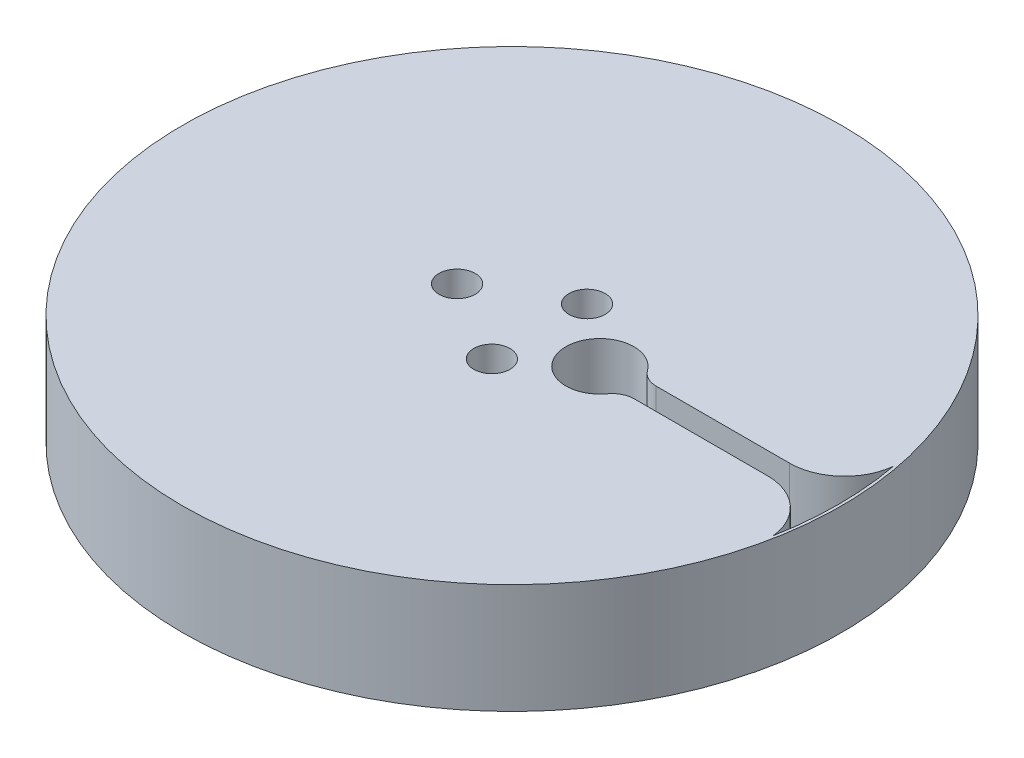
ISO-10303-21;
HEADER;
FILE_DESCRIPTION(('STEP AP214'),'2;1');
FILE_NAME('part.step','',(''),(''),'','','');
FILE_SCHEMA(('AUTOMOTIVE_DESIGN { 1 0 10303 214 1 1 1 1 }'));
ENDSEC;
DATA;
#1=APPLICATION_CONTEXT('core data for automotive mechanical design processes');
#2=APPLICATION_PROTOCOL_DEFINITION('international standard','automotive_design',2000,#1);
#3=PRODUCT_CONTEXT('',#1,'mechanical');
#4=PRODUCT('Part','Part','',(#3));
#5=PRODUCT_RELATED_PRODUCT_CATEGORY('part','',(#4));
#6=PRODUCT_DEFINITION_FORMATION('','',#4);
#7=PRODUCT_DEFINITION_CONTEXT('part definition',#1,'design');
#8=PRODUCT_DEFINITION('design','',#6,#7);
#9=PRODUCT_DEFINITION_SHAPE('','',#8);
#10=(LENGTH_UNIT() NAMED_UNIT(*) SI_UNIT(.MILLI.,.METRE.));
#11=(NAMED_UNIT(*) PLANE_ANGLE_UNIT() SI_UNIT($,.RADIAN.));
#12=(NAMED_UNIT(*) SI_UNIT($,.STERADIAN.) SOLID_ANGLE_UNIT());
#13=UNCERTAINTY_MEASURE_WITH_UNIT(LENGTH_MEASURE(1.E-05),#10,'distance_accuracy_value','');
#14=(GEOMETRIC_REPRESENTATION_CONTEXT(3) GLOBAL_UNCERTAINTY_ASSIGNED_CONTEXT((#13)) GLOBAL_UNIT_ASSIGNED_CONTEXT((#10,
#11,#12)) REPRESENTATION_CONTEXT('',''));
#15=CARTESIAN_POINT('',(0.,0.,0.));
#16=DIRECTION('',(0.,0.,1.));
#17=DIRECTION('',(1.,0.,0.));
#18=AXIS2_PLACEMENT_3D('',#15,#16,#17);
#19=CARTESIAN_POINT('',(24.2693221990232,10.,-6.));
#20=DIRECTION('',(0.,-1.,0.));
#21=DIRECTION('',(0.,0.,-1.));
#22=AXIS2_PLACEMENT_3D('',#19,#20,#21);
#23=CYLINDRICAL_SURFACE('',#22,5.);
#24=CARTESIAN_POINT('',(24.2693221990232,0.,-6.));
#25=DIRECTION('',(0.,1.,0.));
#26=DIRECTION('',(0.,0.,1.));
#27=AXIS2_PLACEMENT_3D('',#24,#25,#26);
#28=CIRCLE('',#27,5.);
#29=CARTESIAN_POINT('',(29.2417500663392,0.,-5.47563266278417));
#30=VERTEX_POINT('',#29);
#31=CARTESIAN_POINT('',(24.2693221990232,0.,-1.));
#32=VERTEX_POINT('',#31);
#33=EDGE_CURVE('E128',#30,#32,#28,.F.);
#34=ORIENTED_EDGE('',*,*,#33,.F.);
#35=DIRECTION('',(0.,-1.,0.));
#36=VECTOR('',#35,1.);
#37=CARTESIAN_POINT('',(29.2417500663392,5.,-5.47563266278417));
#38=LINE('',#37,#36);
#39=CARTESIAN_POINT('',(29.2417500663392,10.,-5.47563266278417));
#40=VERTEX_POINT('',#39);
#41=EDGE_CURVE('E119',#30,#40,#38,.F.);
#42=ORIENTED_EDGE('',*,*,#41,.T.);
#43=CARTESIAN_POINT('',(24.2693221990232,10.,-6.));
#44=DIRECTION('',(0.,1.,0.));
#45=DIRECTION('',(0.,0.,1.));
#46=AXIS2_PLACEMENT_3D('',#43,#44,#45);
#47=CIRCLE('',#46,5.);
#48=CARTESIAN_POINT('',(24.2693221990232,10.,-1.));
#49=VERTEX_POINT('',#48);
#50=EDGE_CURVE('E117',#49,#40,#47,.T.);
#51=ORIENTED_EDGE('',*,*,#50,.F.);
#52=DIRECTION('',(0.,-1.,0.));
#53=VECTOR('',#52,1.);
#54=CARTESIAN_POINT('',(24.2693221990232,10.,-1.));
#55=LINE('',#54,#53);
#56=EDGE_CURVE('E123',#32,#49,#55,.F.);
#57=ORIENTED_EDGE('',*,*,#56,.F.);
#58=EDGE_LOOP('',(#34,#42,#51,#57));
#59=FACE_BOUND('',#58,.T.);
#60=ADVANCED_FACE('F43',(#59),#23,.T.);
#61=CARTESIAN_POINT('',(24.2693221990232,10.,6.));
#62=DIRECTION('',(0.,-1.,0.));
#63=DIRECTION('',(0.,0.,-1.));
#64=AXIS2_PLACEMENT_3D('',#61,#62,#63);
#65=CYLINDRICAL_SURFACE('',#64,5.);
#66=CARTESIAN_POINT('',(24.2693221990232,10.,6.));
#67=DIRECTION('',(0.,1.,0.));
#68=DIRECTION('',(0.,0.,1.));
#69=AXIS2_PLACEMENT_3D('',#66,#67,#68);
#70=CIRCLE('',#69,5.);
#71=CARTESIAN_POINT('',(29.2417500663392,10.,5.47563266278417));
#72=VERTEX_POINT('',#71);
#73=CARTESIAN_POINT('',(24.2693221990232,10.,1.));
#74=VERTEX_POINT('',#73);
#75=EDGE_CURVE('E113',#72,#74,#70,.T.);
#76=ORIENTED_EDGE('',*,*,#75,.F.);
#77=DIRECTION('',(0.,-1.,0.));
#78=VECTOR('',#77,1.);
#79=CARTESIAN_POINT('',(29.2417500663392,5.,5.47563266278417));
#80=LINE('',#79,#78);
#81=CARTESIAN_POINT('',(29.2417500663392,0.,5.47563266278417));
#82=VERTEX_POINT('',#81);
#83=EDGE_CURVE('E11',#72,#82,#80,.T.);
#84=ORIENTED_EDGE('',*,*,#83,.T.);
#85=CARTESIAN_POINT('',(24.2693221990232,0.,6.));
#86=DIRECTION('',(0.,1.,0.));
#87=DIRECTION('',(0.,0.,1.));
#88=AXIS2_PLACEMENT_3D('',#85,#86,#87);
#89=CIRCLE('',#88,5.);
#90=CARTESIAN_POINT('',(24.2693221990232,0.,1.));
#91=VERTEX_POINT('',#90);
#92=EDGE_CURVE('E143',#91,#82,#89,.F.);
#93=ORIENTED_EDGE('',*,*,#92,.F.);
#94=DIRECTION('',(0.,-1.,0.));
#95=VECTOR('',#94,1.);
#96=CARTESIAN_POINT('',(24.2693221990232,10.,1.));
#97=LINE('',#96,#95);
#98=EDGE_CURVE('E52',#74,#91,#97,.T.);
#99=ORIENTED_EDGE('',*,*,#98,.F.);
#100=EDGE_LOOP('',(#76,#84,#93,#99));
#101=FACE_BOUND('',#100,.T.);
#102=ADVANCED_FACE('F45',(#101),#65,.T.);
#103=CARTESIAN_POINT('',(0.,10.,0.));
#104=DIRECTION('',(0.,-1.,0.));
#105=DIRECTION('',(0.,0.,-1.));
#106=AXIS2_PLACEMENT_3D('',#103,#104,#105);
#107=CYLINDRICAL_SURFACE('',#106,30.);
#108=CARTESIAN_POINT('',(0.,0.,0.));
#109=DIRECTION('',(0.,1.,0.));
#110=DIRECTION('',(0.,0.,1.));
#111=AXIS2_PLACEMENT_3D('',#108,#109,#110);
#112=CIRCLE('',#111,30.);
#113=CARTESIAN_POINT('',(0.,0.,30.));
#114=VERTEX_POINT('',#113);
#115=EDGE_CURVE('E178',#114,#114,#112,.T.);
#116=ORIENTED_EDGE('',*,*,#115,.T.);
#117=EDGE_LOOP('',(#116));
#118=FACE_BOUND('',#117,.T.);
#119=CARTESIAN_POINT('',(0.,10.,0.));
#120=DIRECTION('',(0.,1.,0.));
#121=DIRECTION('',(0.,0.,1.));
#122=AXIS2_PLACEMENT_3D('',#119,#120,#121);
#123=CIRCLE('',#122,30.);
#124=CARTESIAN_POINT('',(0.,10.,30.));
#125=VERTEX_POINT('',#124);
#126=EDGE_CURVE('E148',#125,#125,#123,.T.);
#127=ORIENTED_EDGE('',*,*,#126,.F.);
#128=EDGE_LOOP('',(#127));
#129=FACE_BOUND('',#128,.T.);
#130=ADVANCED_FACE('F263',(#118,#129),#107,.T.);
#131=CARTESIAN_POINT('',(0.,10.,0.));
#132=DIRECTION('',(0.,1.,0.));
#133=DIRECTION('',(0.,0.,1.));
#134=AXIS2_PLACEMENT_3D('',#131,#132,#133);
#135=PLANE('',#134);
#136=ORIENTED_EDGE('',*,*,#126,.T.);
#137=EDGE_LOOP('',(#136));
#138=FACE_BOUND('',#137,.T.);
#139=CARTESIAN_POINT('',(0.,10.,0.));
#140=DIRECTION('',(0.,-1.,0.));
#141=DIRECTION('',(0.,0.,-1.));
#142=AXIS2_PLACEMENT_3D('',#139,#140,#141);
#143=CIRCLE('',#142,29.75);
#144=EDGE_CURVE('E59',#40,#72,#143,.T.);
#145=ORIENTED_EDGE('',*,*,#144,.T.);
#146=ORIENTED_EDGE('',*,*,#75,.T.);
#147=DIRECTION('',(-1.,0.,0.));
#148=VECTOR('',#147,1.);
#149=CARTESIAN_POINT('',(10.9342801502242,10.,1.));
#150=LINE('',#149,#148);
#151=CARTESIAN_POINT('',(12.1243181254603,10.,1.));
#152=VERTEX_POINT('',#151);
#153=EDGE_CURVE('E139',#74,#152,#150,.T.);
#154=ORIENTED_EDGE('',*,*,#153,.T.);
#155=CARTESIAN_POINT('',(12.1243181254603,10.,3.));
#156=DIRECTION('',(0.,1.,0.));
#157=DIRECTION('',(0.,0.,1.));
#158=AXIS2_PLACEMENT_3D('',#155,#156,#157);
#159=CIRCLE('',#158,2.);
#160=CARTESIAN_POINT('',(10.506938468417,10.,1.82352941176471));
#161=VERTEX_POINT('',#160);
#162=EDGE_CURVE('E160',#152,#161,#159,.T.);
#163=ORIENTED_EDGE('',*,*,#162,.T.);
#164=CARTESIAN_POINT('',(8.,10.,0.));
#165=DIRECTION('',(0.,-1.,0.));
#166=DIRECTION('',(0.,0.,-1.));
#167=AXIS2_PLACEMENT_3D('',#164,#165,#166);
#168=CIRCLE('',#167,3.1);
#169=CARTESIAN_POINT('',(10.506938468417,10.,-1.82352941176471));
#170=VERTEX_POINT('',#169);
#171=EDGE_CURVE('E189',#161,#170,#168,.T.);
#172=ORIENTED_EDGE('',*,*,#171,.T.);
#173=CARTESIAN_POINT('',(12.1243181254603,10.,-3.));
#174=DIRECTION('',(0.,1.,0.));
#175=DIRECTION('',(0.,0.,1.));
#176=AXIS2_PLACEMENT_3D('',#173,#174,#175);
#177=CIRCLE('',#176,2.);
#178=CARTESIAN_POINT('',(12.1243181254603,10.,-1.));
#179=VERTEX_POINT('',#178);
#180=EDGE_CURVE('E155',#170,#179,#177,.T.);
#181=ORIENTED_EDGE('',*,*,#180,.T.);
#182=DIRECTION('',(1.,0.,0.));
#183=VECTOR('',#182,1.);
#184=CARTESIAN_POINT('',(10.9342801502242,10.,-1.));
#185=LINE('',#184,#183);
#186=EDGE_CURVE('E197',#179,#49,#185,.T.);
#187=ORIENTED_EDGE('',*,*,#186,.T.);
#188=ORIENTED_EDGE('',*,*,#50,.T.);
#189=EDGE_LOOP('',(#145,#146,#154,#163,#172,#181,#187,#188));
#190=FACE_BOUND('',#189,.T.);
#191=CARTESIAN_POINT('',(-5.,10.,0.));
#192=DIRECTION('',(0.,-1.,0.));
#193=DIRECTION('',(0.,0.,-1.));
#194=AXIS2_PLACEMENT_3D('',#191,#192,#193);
#195=CIRCLE('',#194,1.65);
#196=CARTESIAN_POINT('',(-5.,10.,-1.65));
#197=VERTEX_POINT('',#196);
#198=EDGE_CURVE('E194',#197,#197,#195,.T.);
#199=ORIENTED_EDGE('',*,*,#198,.T.);
#200=EDGE_LOOP('',(#199));
#201=FACE_BOUND('',#200,.T.);
#202=CARTESIAN_POINT('',(2.50000000000008,10.,4.33012701892215));
#203=DIRECTION('',(0.,-1.,0.));
#204=DIRECTION('',(0.,0.,-1.));
#205=AXIS2_PLACEMENT_3D('',#202,#203,#204);
#206=CIRCLE('',#205,1.65);
#207=CARTESIAN_POINT('',(2.50000000000008,10.,2.68012701892215));
#208=VERTEX_POINT('',#207);
#209=EDGE_CURVE('E211',#208,#208,#206,.T.);
#210=ORIENTED_EDGE('',*,*,#209,.T.);
#211=EDGE_LOOP('',(#210));
#212=FACE_BOUND('',#211,.T.);
#213=CARTESIAN_POINT('',(2.4999999999999,10.,-4.33012701892225));
#214=DIRECTION('',(0.,-1.,0.));
#215=DIRECTION('',(0.,0.,-1.));
#216=AXIS2_PLACEMENT_3D('',#213,#214,#215);
#217=CIRCLE('',#216,1.65);
#218=CARTESIAN_POINT('',(2.4999999999999,10.,-5.98012701892225));
#219=VERTEX_POINT('',#218);
#220=EDGE_CURVE('E203',#219,#219,#217,.T.);
#221=ORIENTED_EDGE('',*,*,#220,.T.);
#222=EDGE_LOOP('',(#221));
#223=FACE_BOUND('',#222,.T.);
#224=ADVANCED_FACE('F111',(#138,#190,#201,#212,#223),#135,.T.);
#225=CARTESIAN_POINT('',(0.,0.,0.));
#226=DIRECTION('',(0.,1.,0.));
#227=DIRECTION('',(0.,0.,1.));
#228=AXIS2_PLACEMENT_3D('',#225,#226,#227);
#229=PLANE('',#228);
#230=CARTESIAN_POINT('',(0.,0.,0.));
#231=DIRECTION('',(0.,-1.,0.));
#232=DIRECTION('',(0.,0.,-1.));
#233=AXIS2_PLACEMENT_3D('',#230,#231,#232);
#234=CIRCLE('',#233,29.75);
#235=EDGE_CURVE('E64',#30,#82,#234,.T.);
#236=ORIENTED_EDGE('',*,*,#235,.F.);
#237=ORIENTED_EDGE('',*,*,#33,.T.);
#238=DIRECTION('',(1.,0.,0.));
#239=VECTOR('',#238,1.);
#240=CARTESIAN_POINT('',(10.9342801502242,0.,-1.));
#241=LINE('',#240,#239);
#242=CARTESIAN_POINT('',(12.1243181254603,0.,-1.));
#243=VERTEX_POINT('',#242);
#244=EDGE_CURVE('E185',#243,#32,#241,.T.);
#245=ORIENTED_EDGE('',*,*,#244,.F.);
#246=CARTESIAN_POINT('',(12.1243181254603,0.,-3.));
#247=DIRECTION('',(0.,1.,0.));
#248=DIRECTION('',(0.,0.,1.));
#249=AXIS2_PLACEMENT_3D('',#246,#247,#248);
#250=CIRCLE('',#249,2.);
#251=CARTESIAN_POINT('',(10.506938468417,0.,-1.82352941176471));
#252=VERTEX_POINT('',#251);
#253=EDGE_CURVE('E170',#243,#252,#250,.F.);
#254=ORIENTED_EDGE('',*,*,#253,.T.);
#255=CARTESIAN_POINT('',(8.,0.,0.));
#256=DIRECTION('',(0.,-1.,0.));
#257=DIRECTION('',(0.,0.,-1.));
#258=AXIS2_PLACEMENT_3D('',#255,#256,#257);
#259=CIRCLE('',#258,3.1);
#260=CARTESIAN_POINT('',(10.506938468417,0.,1.82352941176471));
#261=VERTEX_POINT('',#260);
#262=EDGE_CURVE('E190',#261,#252,#259,.T.);
#263=ORIENTED_EDGE('',*,*,#262,.F.);
#264=CARTESIAN_POINT('',(12.1243181254603,0.,3.));
#265=DIRECTION('',(0.,1.,0.));
#266=DIRECTION('',(0.,0.,1.));
#267=AXIS2_PLACEMENT_3D('',#264,#265,#266);
#268=CIRCLE('',#267,2.);
#269=CARTESIAN_POINT('',(12.1243181254603,0.,1.));
#270=VERTEX_POINT('',#269);
#271=EDGE_CURVE('E145',#261,#270,#268,.F.);
#272=ORIENTED_EDGE('',*,*,#271,.T.);
#273=DIRECTION('',(1.,0.,0.));
#274=VECTOR('',#273,1.);
#275=CARTESIAN_POINT('',(0.,0.,1.));
#276=LINE('',#275,#274);
#277=EDGE_CURVE('E137',#270,#91,#276,.T.);
#278=ORIENTED_EDGE('',*,*,#277,.T.);
#279=ORIENTED_EDGE('',*,*,#92,.T.);
#280=EDGE_LOOP('',(#236,#237,#245,#254,#263,#272,#278,#279));
#281=FACE_BOUND('',#280,.T.);
#282=ORIENTED_EDGE('',*,*,#115,.F.);
#283=EDGE_LOOP('',(#282));
#284=FACE_BOUND('',#283,.T.);
#285=CARTESIAN_POINT('',(2.4999999999999,0.,-4.33012701892225));
#286=DIRECTION('',(0.,-1.,0.));
#287=DIRECTION('',(0.,0.,-1.));
#288=AXIS2_PLACEMENT_3D('',#285,#286,#287);
#289=CIRCLE('',#288,1.65);
#290=CARTESIAN_POINT('',(2.4999999999999,0.,-5.98012701892225));
#291=VERTEX_POINT('',#290);
#292=EDGE_CURVE('E207',#291,#291,#289,.T.);
#293=ORIENTED_EDGE('',*,*,#292,.F.);
#294=EDGE_LOOP('',(#293));
#295=FACE_BOUND('',#294,.T.);
#296=CARTESIAN_POINT('',(2.50000000000008,0.,4.33012701892215));
#297=DIRECTION('',(0.,-1.,0.));
#298=DIRECTION('',(0.,0.,-1.));
#299=AXIS2_PLACEMENT_3D('',#296,#297,#298);
#300=CIRCLE('',#299,1.65);
#301=CARTESIAN_POINT('',(2.50000000000008,0.,2.68012701892215));
#302=VERTEX_POINT('',#301);
#303=EDGE_CURVE('E215',#302,#302,#300,.T.);
#304=ORIENTED_EDGE('',*,*,#303,.F.);
#305=EDGE_LOOP('',(#304));
#306=FACE_BOUND('',#305,.T.);
#307=CARTESIAN_POINT('',(-5.,0.,0.));
#308=DIRECTION('',(0.,-1.,0.));
#309=DIRECTION('',(0.,0.,-1.));
#310=AXIS2_PLACEMENT_3D('',#307,#308,#309);
#311=CIRCLE('',#310,1.65);
#312=CARTESIAN_POINT('',(-5.,0.,-1.65));
#313=VERTEX_POINT('',#312);
#314=EDGE_CURVE('E219',#313,#313,#311,.T.);
#315=ORIENTED_EDGE('',*,*,#314,.F.);
#316=EDGE_LOOP('',(#315));
#317=FACE_BOUND('',#316,.T.);
#318=ADVANCED_FACE('F141',(#281,#284,#295,#306,#317),#229,.F.);
#319=CARTESIAN_POINT('',(10.9342801502242,10.,1.));
#320=DIRECTION('',(0.,0.,1.));
#321=DIRECTION('',(1.,0.,0.));
#322=AXIS2_PLACEMENT_3D('',#319,#320,#321);
#323=PLANE('',#322);
#324=ORIENTED_EDGE('',*,*,#153,.F.);
#325=ORIENTED_EDGE('',*,*,#98,.T.);
#326=ORIENTED_EDGE('',*,*,#277,.F.);
#327=DIRECTION('',(0.,-1.,0.));
#328=VECTOR('',#327,1.);
#329=CARTESIAN_POINT('',(12.1243181254603,10.,1.));
#330=LINE('',#329,#328);
#331=EDGE_CURVE('E151',#270,#152,#330,.F.);
#332=ORIENTED_EDGE('',*,*,#331,.T.);
#333=EDGE_LOOP('',(#324,#325,#326,#332));
#334=FACE_BOUND('',#333,.T.);
#335=ADVANCED_FACE('F135',(#334),#323,.F.);
#336=CARTESIAN_POINT('',(10.9342801502242,10.,-1.));
#337=DIRECTION('',(0.,0.,-1.));
#338=DIRECTION('',(-1.,0.,0.));
#339=AXIS2_PLACEMENT_3D('',#336,#337,#338);
#340=PLANE('',#339);
#341=ORIENTED_EDGE('',*,*,#244,.T.);
#342=ORIENTED_EDGE('',*,*,#56,.T.);
#343=ORIENTED_EDGE('',*,*,#186,.F.);
#344=DIRECTION('',(0.,-1.,0.));
#345=VECTOR('',#344,1.);
#346=CARTESIAN_POINT('',(12.1243181254603,10.,-1.));
#347=LINE('',#346,#345);
#348=EDGE_CURVE('E147',#179,#243,#347,.T.);
#349=ORIENTED_EDGE('',*,*,#348,.T.);
#350=EDGE_LOOP('',(#341,#342,#343,#349));
#351=FACE_BOUND('',#350,.T.);
#352=ADVANCED_FACE('F234',(#351),#340,.F.);
#353=CARTESIAN_POINT('',(8.,10.,0.));
#354=DIRECTION('',(0.,-1.,0.));
#355=DIRECTION('',(0.,0.,-1.));
#356=AXIS2_PLACEMENT_3D('',#353,#354,#355);
#357=CYLINDRICAL_SURFACE('',#356,3.1);
#358=ORIENTED_EDGE('',*,*,#262,.T.);
#359=DIRECTION('',(0.,-1.,0.));
#360=VECTOR('',#359,1.);
#361=CARTESIAN_POINT('',(10.506938468417,10.,-1.82352941176471));
#362=LINE('',#361,#360);
#363=EDGE_CURVE('E163',#252,#170,#362,.F.);
#364=ORIENTED_EDGE('',*,*,#363,.T.);
#365=ORIENTED_EDGE('',*,*,#171,.F.);
#366=DIRECTION('',(0.,-1.,0.));
#367=VECTOR('',#366,1.);
#368=CARTESIAN_POINT('',(10.506938468417,10.,1.82352941176471));
#369=LINE('',#368,#367);
#370=EDGE_CURVE('E166',#161,#261,#369,.T.);
#371=ORIENTED_EDGE('',*,*,#370,.T.);
#372=EDGE_LOOP('',(#358,#364,#365,#371));
#373=FACE_BOUND('',#372,.T.);
#374=ADVANCED_FACE('F242',(#373),#357,.F.);
#375=CARTESIAN_POINT('',(12.1243181254603,10.,-3.));
#376=DIRECTION('',(0.,-1.,0.));
#377=DIRECTION('',(0.,0.,-1.));
#378=AXIS2_PLACEMENT_3D('',#375,#376,#377);
#379=CYLINDRICAL_SURFACE('',#378,2.);
#380=ORIENTED_EDGE('',*,*,#180,.F.);
#381=ORIENTED_EDGE('',*,*,#363,.F.);
#382=ORIENTED_EDGE('',*,*,#253,.F.);
#383=ORIENTED_EDGE('',*,*,#348,.F.);
#384=EDGE_LOOP('',(#380,#381,#382,#383));
#385=FACE_BOUND('',#384,.T.);
#386=ADVANCED_FACE('F239',(#385),#379,.T.);
#387=CARTESIAN_POINT('',(12.1243181254603,10.,3.));
#388=DIRECTION('',(0.,-1.,0.));
#389=DIRECTION('',(0.,0.,-1.));
#390=AXIS2_PLACEMENT_3D('',#387,#388,#389);
#391=CYLINDRICAL_SURFACE('',#390,2.);
#392=ORIENTED_EDGE('',*,*,#162,.F.);
#393=ORIENTED_EDGE('',*,*,#331,.F.);
#394=ORIENTED_EDGE('',*,*,#271,.F.);
#395=ORIENTED_EDGE('',*,*,#370,.F.);
#396=EDGE_LOOP('',(#392,#393,#394,#395));
#397=FACE_BOUND('',#396,.T.);
#398=ADVANCED_FACE('F247',(#397),#391,.T.);
#399=CARTESIAN_POINT('',(2.4999999999999,10.,-4.33012701892225));
#400=DIRECTION('',(0.,-1.,0.));
#401=DIRECTION('',(0.,0.,-1.));
#402=AXIS2_PLACEMENT_3D('',#399,#400,#401);
#403=CYLINDRICAL_SURFACE('',#402,1.65);
#404=ORIENTED_EDGE('',*,*,#220,.F.);
#405=EDGE_LOOP('',(#404));
#406=FACE_BOUND('',#405,.T.);
#407=ORIENTED_EDGE('',*,*,#292,.T.);
#408=EDGE_LOOP('',(#407));
#409=FACE_BOUND('',#408,.T.);
#410=ADVANCED_FACE('F249',(#406,#409),#403,.F.);
#411=CARTESIAN_POINT('',(2.50000000000008,10.,4.33012701892215));
#412=DIRECTION('',(0.,-1.,0.));
#413=DIRECTION('',(0.,0.,-1.));
#414=AXIS2_PLACEMENT_3D('',#411,#412,#413);
#415=CYLINDRICAL_SURFACE('',#414,1.65);
#416=ORIENTED_EDGE('',*,*,#209,.F.);
#417=EDGE_LOOP('',(#416));
#418=FACE_BOUND('',#417,.T.);
#419=ORIENTED_EDGE('',*,*,#303,.T.);
#420=EDGE_LOOP('',(#419));
#421=FACE_BOUND('',#420,.T.);
#422=ADVANCED_FACE('F255',(#418,#421),#415,.F.);
#423=CARTESIAN_POINT('',(-5.,10.,0.));
#424=DIRECTION('',(0.,-1.,0.));
#425=DIRECTION('',(0.,0.,-1.));
#426=AXIS2_PLACEMENT_3D('',#423,#424,#425);
#427=CYLINDRICAL_SURFACE('',#426,1.65);
#428=ORIENTED_EDGE('',*,*,#198,.F.);
#429=EDGE_LOOP('',(#428));
#430=FACE_BOUND('',#429,.T.);
#431=ORIENTED_EDGE('',*,*,#314,.T.);
#432=EDGE_LOOP('',(#431));
#433=FACE_BOUND('',#432,.T.);
#434=ADVANCED_FACE('F286',(#430,#433),#427,.F.);
#435=CARTESIAN_POINT('',(0.,10.,0.));
#436=DIRECTION('',(0.,-1.,0.));
#437=DIRECTION('',(0.,0.,-1.));
#438=AXIS2_PLACEMENT_3D('',#435,#436,#437);
#439=CYLINDRICAL_SURFACE('',#438,29.75);
#440=ORIENTED_EDGE('',*,*,#41,.F.);
#441=ORIENTED_EDGE('',*,*,#235,.T.);
#442=ORIENTED_EDGE('',*,*,#83,.F.);
#443=ORIENTED_EDGE('',*,*,#144,.F.);
#444=EDGE_LOOP('',(#440,#441,#442,#443));
#445=FACE_BOUND('',#444,.T.);
#446=ADVANCED_FACE('F104',(#445),#439,.F.);
#447=CLOSED_SHELL('',(#60,#102,#130,#224,#318,#335,#352,#374,#386,#398,#410,#422,#434,#446));
#448=MANIFOLD_SOLID_BREP('B2',#447);
#449=ADVANCED_BREP_SHAPE_REPRESENTATION('',(#18,#448),#14);
#450=SHAPE_DEFINITION_REPRESENTATION(#9,#449);
ENDSEC;
END-ISO-10303-21;
